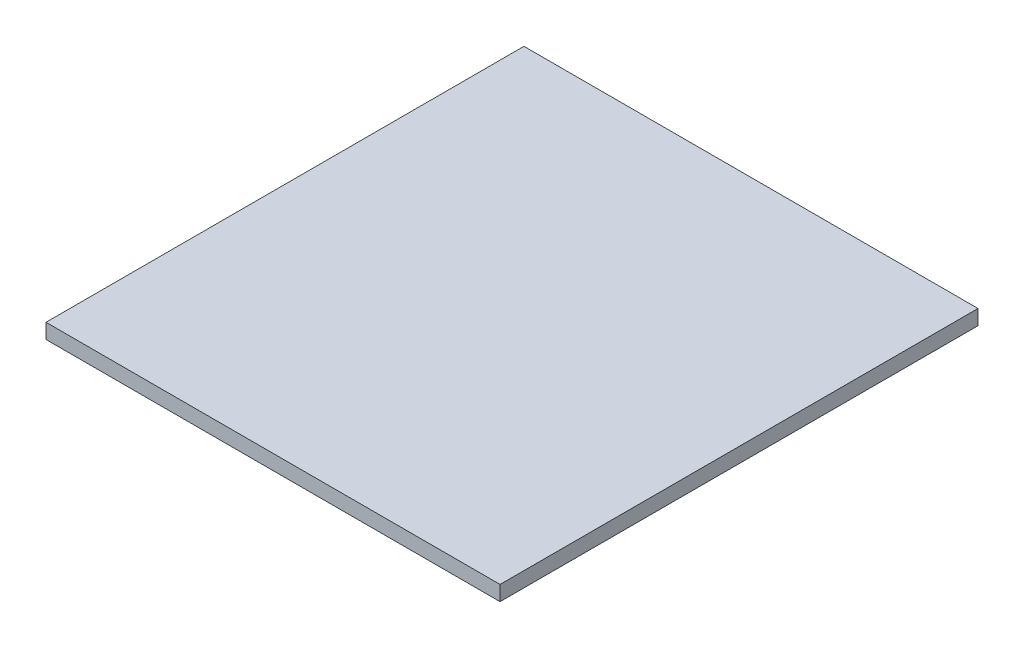
ISO-10303-21;
HEADER;
FILE_DESCRIPTION(('STEP AP214'),'2;1');
FILE_NAME('part.step','',(''),(''),'','','');
FILE_SCHEMA(('AUTOMOTIVE_DESIGN { 1 0 10303 214 1 1 1 1 }'));
ENDSEC;
DATA;
#1=APPLICATION_CONTEXT('core data for automotive mechanical design processes');
#2=APPLICATION_PROTOCOL_DEFINITION('international standard','automotive_design',2000,#1);
#3=PRODUCT_CONTEXT('',#1,'mechanical');
#4=PRODUCT('Part','Part','',(#3));
#5=PRODUCT_RELATED_PRODUCT_CATEGORY('part','',(#4));
#6=PRODUCT_DEFINITION_FORMATION('','',#4);
#7=PRODUCT_DEFINITION_CONTEXT('part definition',#1,'design');
#8=PRODUCT_DEFINITION('design','',#6,#7);
#9=PRODUCT_DEFINITION_SHAPE('','',#8);
#10=(LENGTH_UNIT() NAMED_UNIT(*) SI_UNIT(.MILLI.,.METRE.));
#11=(NAMED_UNIT(*) PLANE_ANGLE_UNIT() SI_UNIT($,.RADIAN.));
#12=(NAMED_UNIT(*) SI_UNIT($,.STERADIAN.) SOLID_ANGLE_UNIT());
#13=UNCERTAINTY_MEASURE_WITH_UNIT(LENGTH_MEASURE(1.E-05),#10,'distance_accuracy_value','');
#14=(GEOMETRIC_REPRESENTATION_CONTEXT(3) GLOBAL_UNCERTAINTY_ASSIGNED_CONTEXT((#13)) GLOBAL_UNIT_ASSIGNED_CONTEXT((#10,
#11,#12)) REPRESENTATION_CONTEXT('',''));
#15=CARTESIAN_POINT('',(0.,0.,0.));
#16=DIRECTION('',(0.,0.,1.));
#17=DIRECTION('',(1.,0.,0.));
#18=AXIS2_PLACEMENT_3D('',#15,#16,#17);
#19=CARTESIAN_POINT('',(0.,3.175,0.));
#20=DIRECTION('',(1.,0.,0.));
#21=DIRECTION('',(0.,0.,-1.));
#22=AXIS2_PLACEMENT_3D('',#19,#20,#21);
#23=PLANE('',#22);
#24=DIRECTION('',(0.,0.,1.));
#25=VECTOR('',#24,1.);
#26=CARTESIAN_POINT('',(0.,0.,0.));
#27=LINE('',#26,#25);
#28=CARTESIAN_POINT('',(0.,0.,-101.6));
#29=VERTEX_POINT('',#28);
#30=CARTESIAN_POINT('',(0.,0.,0.));
#31=VERTEX_POINT('',#30);
#32=EDGE_CURVE('E96',#29,#31,#27,.T.);
#33=ORIENTED_EDGE('',*,*,#32,.T.);
#34=DIRECTION('',(0.,-1.,0.));
#35=VECTOR('',#34,1.);
#36=CARTESIAN_POINT('',(0.,3.175,0.));
#37=LINE('',#36,#35);
#38=CARTESIAN_POINT('',(0.,3.175,0.));
#39=VERTEX_POINT('',#38);
#40=EDGE_CURVE('E11',#39,#31,#37,.T.);
#41=ORIENTED_EDGE('',*,*,#40,.F.);
#42=DIRECTION('',(0.,0.,1.));
#43=VECTOR('',#42,1.);
#44=CARTESIAN_POINT('',(0.,3.175,0.));
#45=LINE('',#44,#43);
#46=CARTESIAN_POINT('',(0.,3.175,-101.6));
#47=VERTEX_POINT('',#46);
#48=EDGE_CURVE('E84',#47,#39,#45,.T.);
#49=ORIENTED_EDGE('',*,*,#48,.F.);
#50=DIRECTION('',(0.,-1.,0.));
#51=VECTOR('',#50,1.);
#52=CARTESIAN_POINT('',(0.,3.175,-101.6));
#53=LINE('',#52,#51);
#54=EDGE_CURVE('E92',#47,#29,#53,.T.);
#55=ORIENTED_EDGE('',*,*,#54,.T.);
#56=EDGE_LOOP('',(#33,#41,#49,#55));
#57=FACE_BOUND('',#56,.T.);
#58=ADVANCED_FACE('F33',(#57),#23,.F.);
#59=CARTESIAN_POINT('',(0.,3.175,0.));
#60=DIRECTION('',(0.,0.,-1.));
#61=DIRECTION('',(-1.,0.,0.));
#62=AXIS2_PLACEMENT_3D('',#59,#60,#61);
#63=PLANE('',#62);
#64=DIRECTION('',(1.,0.,0.));
#65=VECTOR('',#64,1.);
#66=CARTESIAN_POINT('',(0.,0.,0.));
#67=LINE('',#66,#65);
#68=CARTESIAN_POINT('',(96.52,0.,0.));
#69=VERTEX_POINT('',#68);
#70=EDGE_CURVE('E88',#31,#69,#67,.T.);
#71=ORIENTED_EDGE('',*,*,#70,.T.);
#72=DIRECTION('',(0.,-1.,0.));
#73=VECTOR('',#72,1.);
#74=CARTESIAN_POINT('',(96.52,3.175,0.));
#75=LINE('',#74,#73);
#76=CARTESIAN_POINT('',(96.52,3.175,0.));
#77=VERTEX_POINT('',#76);
#78=EDGE_CURVE('E41',#77,#69,#75,.T.);
#79=ORIENTED_EDGE('',*,*,#78,.F.);
#80=DIRECTION('',(1.,0.,0.));
#81=VECTOR('',#80,1.);
#82=CARTESIAN_POINT('',(0.,3.175,0.));
#83=LINE('',#82,#81);
#84=EDGE_CURVE('E79',#39,#77,#83,.T.);
#85=ORIENTED_EDGE('',*,*,#84,.F.);
#86=ORIENTED_EDGE('',*,*,#40,.T.);
#87=EDGE_LOOP('',(#71,#79,#85,#86));
#88=FACE_BOUND('',#87,.T.);
#89=ADVANCED_FACE('F87',(#88),#63,.F.);
#90=CARTESIAN_POINT('',(96.52,3.175,0.));
#91=DIRECTION('',(-1.,0.,0.));
#92=DIRECTION('',(0.,0.,1.));
#93=AXIS2_PLACEMENT_3D('',#90,#91,#92);
#94=PLANE('',#93);
#95=DIRECTION('',(0.,0.,-1.));
#96=VECTOR('',#95,1.);
#97=CARTESIAN_POINT('',(96.52,0.,0.));
#98=LINE('',#97,#96);
#99=CARTESIAN_POINT('',(96.52,0.,-101.6));
#100=VERTEX_POINT('',#99);
#101=EDGE_CURVE('E66',#69,#100,#98,.T.);
#102=ORIENTED_EDGE('',*,*,#101,.T.);
#103=DIRECTION('',(0.,-1.,0.));
#104=VECTOR('',#103,1.);
#105=CARTESIAN_POINT('',(96.52,3.175,-101.6));
#106=LINE('',#105,#104);
#107=CARTESIAN_POINT('',(96.52,3.175,-101.6));
#108=VERTEX_POINT('',#107);
#109=EDGE_CURVE('E89',#108,#100,#106,.T.);
#110=ORIENTED_EDGE('',*,*,#109,.F.);
#111=DIRECTION('',(0.,0.,-1.));
#112=VECTOR('',#111,1.);
#113=CARTESIAN_POINT('',(96.52,3.175,0.));
#114=LINE('',#113,#112);
#115=EDGE_CURVE('E82',#77,#108,#114,.T.);
#116=ORIENTED_EDGE('',*,*,#115,.F.);
#117=ORIENTED_EDGE('',*,*,#78,.T.);
#118=EDGE_LOOP('',(#102,#110,#116,#117));
#119=FACE_BOUND('',#118,.T.);
#120=ADVANCED_FACE('F90',(#119),#94,.F.);
#121=CARTESIAN_POINT('',(0.,3.175,-101.6));
#122=DIRECTION('',(0.,0.,1.));
#123=DIRECTION('',(1.,0.,0.));
#124=AXIS2_PLACEMENT_3D('',#121,#122,#123);
#125=PLANE('',#124);
#126=DIRECTION('',(-1.,0.,0.));
#127=VECTOR('',#126,1.);
#128=CARTESIAN_POINT('',(0.,0.,-101.6));
#129=LINE('',#128,#127);
#130=EDGE_CURVE('E72',#100,#29,#129,.T.);
#131=ORIENTED_EDGE('',*,*,#130,.T.);
#132=ORIENTED_EDGE('',*,*,#54,.F.);
#133=DIRECTION('',(-1.,0.,0.));
#134=VECTOR('',#133,1.);
#135=CARTESIAN_POINT('',(0.,3.175,-101.6));
#136=LINE('',#135,#134);
#137=EDGE_CURVE('E49',#108,#47,#136,.T.);
#138=ORIENTED_EDGE('',*,*,#137,.F.);
#139=ORIENTED_EDGE('',*,*,#109,.T.);
#140=EDGE_LOOP('',(#131,#132,#138,#139));
#141=FACE_BOUND('',#140,.T.);
#142=ADVANCED_FACE('F103',(#141),#125,.F.);
#143=CARTESIAN_POINT('',(0.,3.175,0.));
#144=DIRECTION('',(0.,-1.,0.));
#145=DIRECTION('',(0.,0.,-1.));
#146=AXIS2_PLACEMENT_3D('',#143,#144,#145);
#147=PLANE('',#146);
#148=ORIENTED_EDGE('',*,*,#48,.T.);
#149=ORIENTED_EDGE('',*,*,#84,.T.);
#150=ORIENTED_EDGE('',*,*,#115,.T.);
#151=ORIENTED_EDGE('',*,*,#137,.T.);
#152=EDGE_LOOP('',(#148,#149,#150,#151));
#153=FACE_BOUND('',#152,.T.);
#154=ADVANCED_FACE('F80',(#153),#147,.F.);
#155=CARTESIAN_POINT('',(0.,0.,0.));
#156=DIRECTION('',(0.,-1.,0.));
#157=DIRECTION('',(0.,0.,-1.));
#158=AXIS2_PLACEMENT_3D('',#155,#156,#157);
#159=PLANE('',#158);
#160=ORIENTED_EDGE('',*,*,#32,.F.);
#161=ORIENTED_EDGE('',*,*,#130,.F.);
#162=ORIENTED_EDGE('',*,*,#101,.F.);
#163=ORIENTED_EDGE('',*,*,#70,.F.);
#164=EDGE_LOOP('',(#160,#161,#162,#163));
#165=FACE_BOUND('',#164,.T.);
#166=ADVANCED_FACE('F106',(#165),#159,.T.);
#167=CLOSED_SHELL('',(#58,#89,#120,#142,#154,#166));
#168=MANIFOLD_SOLID_BREP('B2',#167);
#169=ADVANCED_BREP_SHAPE_REPRESENTATION('',(#18,#168),#14);
#170=SHAPE_DEFINITION_REPRESENTATION(#9,#169);
ENDSEC;
END-ISO-10303-21;
